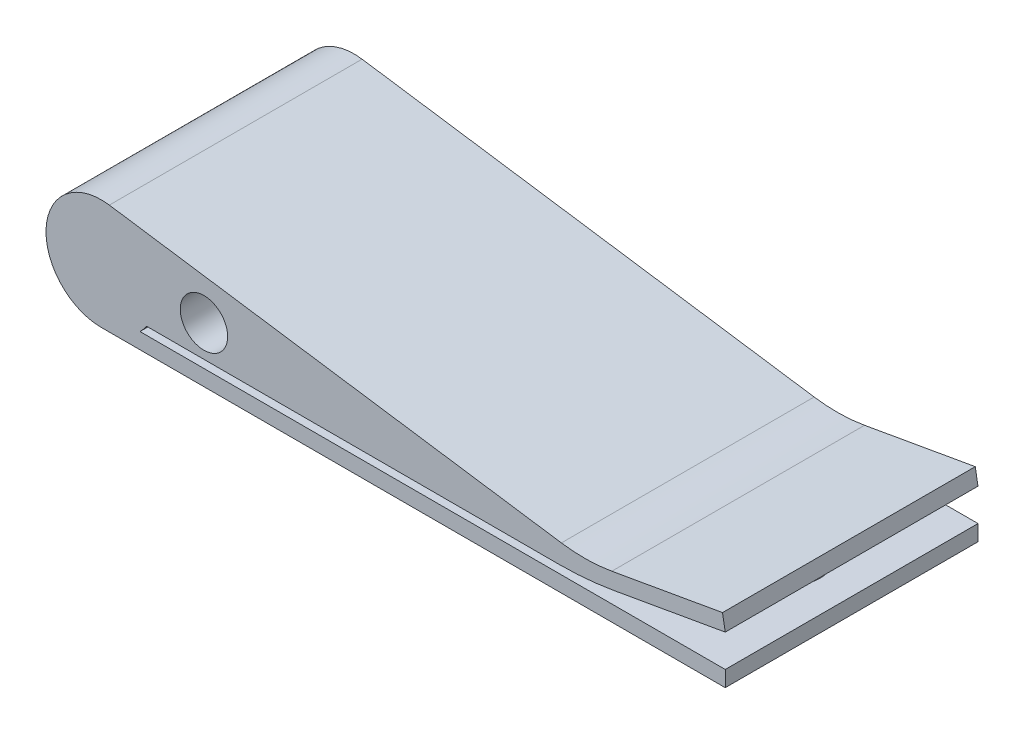
ISO-10303-21;
HEADER;
FILE_DESCRIPTION(('STEP AP214'),'2;1');
FILE_NAME('part.step','',(''),(''),'','','');
FILE_SCHEMA(('AUTOMOTIVE_DESIGN { 1 0 10303 214 1 1 1 1 }'));
ENDSEC;
DATA;
#1=APPLICATION_CONTEXT('core data for automotive mechanical design processes');
#2=APPLICATION_PROTOCOL_DEFINITION('international standard','automotive_design',2000,#1);
#3=PRODUCT_CONTEXT('',#1,'mechanical');
#4=PRODUCT('Part','Part','',(#3));
#5=PRODUCT_RELATED_PRODUCT_CATEGORY('part','',(#4));
#6=PRODUCT_DEFINITION_FORMATION('','',#4);
#7=PRODUCT_DEFINITION_CONTEXT('part definition',#1,'design');
#8=PRODUCT_DEFINITION('design','',#6,#7);
#9=PRODUCT_DEFINITION_SHAPE('','',#8);
#10=(LENGTH_UNIT() NAMED_UNIT(*) SI_UNIT(.MILLI.,.METRE.));
#11=(NAMED_UNIT(*) PLANE_ANGLE_UNIT() SI_UNIT($,.RADIAN.));
#12=(NAMED_UNIT(*) SI_UNIT($,.STERADIAN.) SOLID_ANGLE_UNIT());
#13=UNCERTAINTY_MEASURE_WITH_UNIT(LENGTH_MEASURE(1.E-05),#10,'distance_accuracy_value','');
#14=(GEOMETRIC_REPRESENTATION_CONTEXT(3) GLOBAL_UNCERTAINTY_ASSIGNED_CONTEXT((#13)) GLOBAL_UNIT_ASSIGNED_CONTEXT((#10,
#11,#12)) REPRESENTATION_CONTEXT('',''));
#15=CARTESIAN_POINT('',(0.,0.,0.));
#16=DIRECTION('',(0.,0.,1.));
#17=DIRECTION('',(1.,0.,0.));
#18=AXIS2_PLACEMENT_3D('',#15,#16,#17);
#19=CARTESIAN_POINT('',(43.,0.,16.));
#20=DIRECTION('',(-1.,0.,0.));
#21=DIRECTION('',(0.,0.,1.));
#22=AXIS2_PLACEMENT_3D('',#19,#20,#21);
#23=PLANE('',#22);
#24=DIRECTION('',(0.,1.,0.));
#25=VECTOR('',#24,1.);
#26=CARTESIAN_POINT('',(43.,0.,0.));
#27=LINE('',#26,#25);
#28=CARTESIAN_POINT('',(43.,0.,0.));
#29=VERTEX_POINT('',#28);
#30=CARTESIAN_POINT('',(43.,1.00000000000006,0.));
#31=VERTEX_POINT('',#30);
#32=EDGE_CURVE('E149',#29,#31,#27,.T.);
#33=ORIENTED_EDGE('',*,*,#32,.T.);
#34=DIRECTION('',(0.,0.,-1.));
#35=VECTOR('',#34,1.);
#36=CARTESIAN_POINT('',(43.,1.00000000000006,16.));
#37=LINE('',#36,#35);
#38=CARTESIAN_POINT('',(43.,1.00000000000006,16.));
#39=VERTEX_POINT('',#38);
#40=EDGE_CURVE('E130',#39,#31,#37,.T.);
#41=ORIENTED_EDGE('',*,*,#40,.F.);
#42=DIRECTION('',(0.,1.,0.));
#43=VECTOR('',#42,1.);
#44=CARTESIAN_POINT('',(43.,0.,16.));
#45=LINE('',#44,#43);
#46=CARTESIAN_POINT('',(43.,0.,16.));
#47=VERTEX_POINT('',#46);
#48=EDGE_CURVE('E137',#47,#39,#45,.T.);
#49=ORIENTED_EDGE('',*,*,#48,.F.);
#50=DIRECTION('',(0.,0.,-1.));
#51=VECTOR('',#50,1.);
#52=CARTESIAN_POINT('',(43.,0.,16.));
#53=LINE('',#52,#51);
#54=EDGE_CURVE('E196',#47,#29,#53,.T.);
#55=ORIENTED_EDGE('',*,*,#54,.T.);
#56=EDGE_LOOP('',(#33,#41,#49,#55));
#57=FACE_BOUND('',#56,.T.);
#58=ADVANCED_FACE('F37',(#57),#23,.F.);
#59=CARTESIAN_POINT('',(43.,1.00000000000006,16.));
#60=DIRECTION('',(0.,-1.,0.));
#61=DIRECTION('',(1.,0.,0.));
#62=AXIS2_PLACEMENT_3D('',#59,#60,#61);
#63=PLANE('',#62);
#64=CARTESIAN_POINT('',(39.,1.00000000000005,8.));
#65=DIRECTION('',(0.,-1.,0.));
#66=DIRECTION('',(1.,0.,0.));
#67=AXIS2_PLACEMENT_3D('',#64,#65,#66);
#68=CIRCLE('',#67,2.);
#69=CARTESIAN_POINT('',(41.,1.00000000000006,8.));
#70=VERTEX_POINT('',#69);
#71=EDGE_CURVE('E235',#70,#70,#68,.T.);
#72=ORIENTED_EDGE('',*,*,#71,.T.);
#73=EDGE_LOOP('',(#72));
#74=FACE_BOUND('',#73,.T.);
#75=CARTESIAN_POINT('',(16.,1.00000000000002,8.));
#76=DIRECTION('',(0.,-1.,0.));
#77=DIRECTION('',(1.,0.,0.));
#78=AXIS2_PLACEMENT_3D('',#75,#76,#77);
#79=CIRCLE('',#78,2.);
#80=CARTESIAN_POINT('',(18.,1.00000000000003,8.));
#81=VERTEX_POINT('',#80);
#82=EDGE_CURVE('E238',#81,#81,#79,.T.);
#83=ORIENTED_EDGE('',*,*,#82,.T.);
#84=EDGE_LOOP('',(#83));
#85=FACE_BOUND('',#84,.T.);
#86=DIRECTION('',(-1.,0.,0.));
#87=VECTOR('',#86,1.);
#88=CARTESIAN_POINT('',(43.,1.00000000000006,0.));
#89=LINE('',#88,#87);
#90=CARTESIAN_POINT('',(5.94948974278317,0.999999999999989,0.));
#91=VERTEX_POINT('',#90);
#92=EDGE_CURVE('E214',#31,#91,#89,.T.);
#93=ORIENTED_EDGE('',*,*,#92,.T.);
#94=DIRECTION('',(0.,0.,-1.));
#95=VECTOR('',#94,1.);
#96=CARTESIAN_POINT('',(5.94948974278317,0.999999999999989,16.));
#97=LINE('',#96,#95);
#98=CARTESIAN_POINT('',(5.94948974278317,0.999999999999989,16.));
#99=VERTEX_POINT('',#98);
#100=EDGE_CURVE('E133',#99,#91,#97,.T.);
#101=ORIENTED_EDGE('',*,*,#100,.F.);
#102=DIRECTION('',(-1.,0.,0.));
#103=VECTOR('',#102,1.);
#104=CARTESIAN_POINT('',(43.,1.00000000000006,16.));
#105=LINE('',#104,#103);
#106=EDGE_CURVE('E126',#39,#99,#105,.T.);
#107=ORIENTED_EDGE('',*,*,#106,.F.);
#108=ORIENTED_EDGE('',*,*,#40,.T.);
#109=EDGE_LOOP('',(#93,#101,#107,#108));
#110=FACE_BOUND('',#109,.T.);
#111=ADVANCED_FACE('F128',(#74,#85,#110),#63,.F.);
#112=CARTESIAN_POINT('',(3.5,3.5,16.));
#113=DIRECTION('',(0.,0.,-1.));
#114=DIRECTION('',(-1.,0.,0.));
#115=AXIS2_PLACEMENT_3D('',#112,#113,#114);
#116=CYLINDRICAL_SURFACE('',#115,3.5);
#117=CARTESIAN_POINT('',(3.5,3.5,0.));
#118=DIRECTION('',(0.,0.,1.));
#119=DIRECTION('',(1.,0.,0.));
#120=AXIS2_PLACEMENT_3D('',#117,#118,#119);
#121=CIRCLE('',#120,3.5);
#122=CARTESIAN_POINT('',(6.37228132326901,1.49999999999999,0.));
#123=VERTEX_POINT('',#122);
#124=EDGE_CURVE('E185',#91,#123,#121,.T.);
#125=ORIENTED_EDGE('',*,*,#124,.T.);
#126=DIRECTION('',(0.,0.,-1.));
#127=VECTOR('',#126,1.);
#128=CARTESIAN_POINT('',(6.37228132326901,1.49999999999999,16.));
#129=LINE('',#128,#127);
#130=CARTESIAN_POINT('',(6.37228132326901,1.49999999999999,16.));
#131=VERTEX_POINT('',#130);
#132=EDGE_CURVE('E155',#131,#123,#129,.T.);
#133=ORIENTED_EDGE('',*,*,#132,.F.);
#134=CARTESIAN_POINT('',(3.5,3.5,16.));
#135=DIRECTION('',(0.,0.,1.));
#136=DIRECTION('',(1.,0.,0.));
#137=AXIS2_PLACEMENT_3D('',#134,#135,#136);
#138=CIRCLE('',#137,3.5);
#139=EDGE_CURVE('E136',#99,#131,#138,.T.);
#140=ORIENTED_EDGE('',*,*,#139,.F.);
#141=ORIENTED_EDGE('',*,*,#100,.T.);
#142=EDGE_LOOP('',(#125,#133,#140,#141));
#143=FACE_BOUND('',#142,.T.);
#144=ADVANCED_FACE('F302',(#143),#116,.T.);
#145=CARTESIAN_POINT('',(6.37228132326901,1.49999999999999,16.));
#146=DIRECTION('',(0.,1.,0.));
#147=DIRECTION('',(-1.,0.,0.));
#148=AXIS2_PLACEMENT_3D('',#145,#146,#147);
#149=PLANE('',#148);
#150=DIRECTION('',(1.,0.,0.));
#151=VECTOR('',#150,1.);
#152=CARTESIAN_POINT('',(6.37228132326901,1.49999999999999,0.));
#153=LINE('',#152,#151);
#154=CARTESIAN_POINT('',(32.4765785518145,1.5,0.));
#155=VERTEX_POINT('',#154);
#156=EDGE_CURVE('E181',#123,#155,#153,.T.);
#157=ORIENTED_EDGE('',*,*,#156,.T.);
#158=DIRECTION('',(0.,0.,-1.));
#159=VECTOR('',#158,1.);
#160=CARTESIAN_POINT('',(32.4765785518146,1.5,16.));
#161=LINE('',#160,#159);
#162=CARTESIAN_POINT('',(32.4765785518145,1.5,16.));
#163=VERTEX_POINT('',#162);
#164=EDGE_CURVE('E45',#155,#163,#161,.F.);
#165=ORIENTED_EDGE('',*,*,#164,.T.);
#166=DIRECTION('',(1.,0.,0.));
#167=VECTOR('',#166,1.);
#168=CARTESIAN_POINT('',(6.37228132326901,1.49999999999999,16.));
#169=LINE('',#168,#167);
#170=EDGE_CURVE('E211',#131,#163,#169,.T.);
#171=ORIENTED_EDGE('',*,*,#170,.F.);
#172=ORIENTED_EDGE('',*,*,#132,.T.);
#173=EDGE_LOOP('',(#157,#165,#171,#172));
#174=FACE_BOUND('',#173,.T.);
#175=ADVANCED_FACE('F210',(#174),#149,.F.);
#176=CARTESIAN_POINT('',(34.226351822333,1.5,16.));
#177=DIRECTION('',(-0.173648177666927,0.984807753012209,0.));
#178=DIRECTION('',(-0.984807753012209,-0.173648177666927,0.));
#179=AXIS2_PLACEMENT_3D('',#176,#177,#178);
#180=PLANE('',#179);
#181=DIRECTION('',(0.984807753012209,0.173648177666927,0.));
#182=VECTOR('',#181,1.);
#183=CARTESIAN_POINT('',(34.226351822333,1.5,16.));
#184=LINE('',#183,#182);
#185=CARTESIAN_POINT('',(35.9495421051531,1.80384493975583,16.));
#186=VERTEX_POINT('',#185);
#187=CARTESIAN_POINT('',(43.,3.04703089296632,16.));
#188=VERTEX_POINT('',#187);
#189=EDGE_CURVE('E174',#186,#188,#184,.T.);
#190=ORIENTED_EDGE('',*,*,#189,.F.);
#191=DIRECTION('',(0.,0.,-1.));
#192=VECTOR('',#191,1.);
#193=CARTESIAN_POINT('',(35.9495421051531,1.80384493975583,16.));
#194=LINE('',#193,#192);
#195=CARTESIAN_POINT('',(35.9495421051531,1.80384493975583,0.));
#196=VERTEX_POINT('',#195);
#197=EDGE_CURVE('E164',#186,#196,#194,.T.);
#198=ORIENTED_EDGE('',*,*,#197,.T.);
#199=DIRECTION('',(0.984807753012209,0.173648177666927,0.));
#200=VECTOR('',#199,1.);
#201=CARTESIAN_POINT('',(34.226351822333,1.5,0.));
#202=LINE('',#201,#200);
#203=CARTESIAN_POINT('',(43.,3.04703089296632,0.));
#204=VERTEX_POINT('',#203);
#205=EDGE_CURVE('E172',#196,#204,#202,.T.);
#206=ORIENTED_EDGE('',*,*,#205,.T.);
#207=DIRECTION('',(0.,0.,-1.));
#208=VECTOR('',#207,1.);
#209=CARTESIAN_POINT('',(43.,3.04703089296632,16.));
#210=LINE('',#209,#208);
#211=EDGE_CURVE('E207',#188,#204,#210,.T.);
#212=ORIENTED_EDGE('',*,*,#211,.F.);
#213=EDGE_LOOP('',(#190,#198,#206,#212));
#214=FACE_BOUND('',#213,.T.);
#215=ADVANCED_FACE('F170',(#214),#180,.F.);
#216=CARTESIAN_POINT('',(43.,3.04703089296632,16.));
#217=DIRECTION('',(-0.984807753012208,-0.173648177666928,0.));
#218=DIRECTION('',(0.173648177666928,-0.984807753012208,0.));
#219=AXIS2_PLACEMENT_3D('',#216,#217,#218);
#220=PLANE('',#219);
#221=DIRECTION('',(-0.173648177666928,0.984807753012208,0.));
#222=VECTOR('',#221,1.);
#223=CARTESIAN_POINT('',(43.,3.04703089296632,0.));
#224=LINE('',#223,#222);
#225=CARTESIAN_POINT('',(42.8263518223331,4.03183864597852,0.));
#226=VERTEX_POINT('',#225);
#227=EDGE_CURVE('E180',#204,#226,#224,.T.);
#228=ORIENTED_EDGE('',*,*,#227,.T.);
#229=DIRECTION('',(0.,0.,-1.));
#230=VECTOR('',#229,1.);
#231=CARTESIAN_POINT('',(42.8263518223331,4.03183864597852,16.));
#232=LINE('',#231,#230);
#233=CARTESIAN_POINT('',(42.8263518223331,4.03183864597852,16.));
#234=VERTEX_POINT('',#233);
#235=EDGE_CURVE('E204',#234,#226,#232,.T.);
#236=ORIENTED_EDGE('',*,*,#235,.F.);
#237=DIRECTION('',(-0.173648177666928,0.984807753012208,0.));
#238=VECTOR('',#237,1.);
#239=CARTESIAN_POINT('',(43.,3.04703089296632,16.));
#240=LINE('',#239,#238);
#241=EDGE_CURVE('E227',#188,#234,#240,.T.);
#242=ORIENTED_EDGE('',*,*,#241,.F.);
#243=ORIENTED_EDGE('',*,*,#211,.T.);
#244=EDGE_LOOP('',(#228,#236,#242,#243));
#245=FACE_BOUND('',#244,.T.);
#246=ADVANCED_FACE('F287',(#245),#220,.F.);
#247=CARTESIAN_POINT('',(42.8263518223331,4.03183864597852,16.));
#248=DIRECTION('',(0.173648177666927,-0.984807753012209,0.));
#249=DIRECTION('',(0.984807753012209,0.173648177666927,0.));
#250=AXIS2_PLACEMENT_3D('',#247,#248,#249);
#251=PLANE('',#250);
#252=DIRECTION('',(-0.984807753012209,-0.173648177666927,0.));
#253=VECTOR('',#252,1.);
#254=CARTESIAN_POINT('',(42.8263518223331,4.03183864597852,0.));
#255=LINE('',#254,#253);
#256=CARTESIAN_POINT('',(35.8189788898338,2.79624973409273,0.));
#257=VERTEX_POINT('',#256);
#258=EDGE_CURVE('E183',#226,#257,#255,.T.);
#259=ORIENTED_EDGE('',*,*,#258,.T.);
#260=DIRECTION('',(0.,0.,-1.));
#261=VECTOR('',#260,1.);
#262=CARTESIAN_POINT('',(35.8189788898338,2.79624973409273,16.));
#263=LINE('',#262,#261);
#264=CARTESIAN_POINT('',(35.8189788898338,2.79624973409273,16.));
#265=VERTEX_POINT('',#264);
#266=EDGE_CURVE('E153',#257,#265,#263,.F.);
#267=ORIENTED_EDGE('',*,*,#266,.T.);
#268=DIRECTION('',(-0.984807753012209,-0.173648177666927,0.));
#269=VECTOR('',#268,1.);
#270=CARTESIAN_POINT('',(42.8263518223331,4.03183864597852,16.));
#271=LINE('',#270,#269);
#272=EDGE_CURVE('E224',#234,#265,#271,.T.);
#273=ORIENTED_EDGE('',*,*,#272,.F.);
#274=ORIENTED_EDGE('',*,*,#235,.T.);
#275=EDGE_LOOP('',(#259,#267,#273,#274));
#276=FACE_BOUND('',#275,.T.);
#277=ADVANCED_FACE('F282',(#276),#251,.F.);
#278=CARTESIAN_POINT('',(34.226351822333,2.51542661188574,16.));
#279=DIRECTION('',(-0.145610511259874,-0.98934199294816,0.));
#280=DIRECTION('',(0.98934199294816,-0.145610511259874,0.));
#281=AXIS2_PLACEMENT_3D('',#278,#279,#280);
#282=PLANE('',#281);
#283=DIRECTION('',(-0.98934199294816,0.145610511259874,0.));
#284=VECTOR('',#283,1.);
#285=CARTESIAN_POINT('',(34.226351822333,2.51542661188574,16.));
#286=LINE('',#285,#284);
#287=CARTESIAN_POINT('',(32.6263920005658,2.75090733473321,16.));
#288=VERTEX_POINT('',#287);
#289=CARTESIAN_POINT('',(4.00963678940955,6.96269697531856,16.));
#290=VERTEX_POINT('',#289);
#291=EDGE_CURVE('E222',#288,#290,#286,.T.);
#292=ORIENTED_EDGE('',*,*,#291,.F.);
#293=DIRECTION('',(0.,0.,-1.));
#294=VECTOR('',#293,1.);
#295=CARTESIAN_POINT('',(32.6263920005658,2.75090733473321,0.));
#296=LINE('',#295,#294);
#297=CARTESIAN_POINT('',(32.6263920005658,2.75090733473321,0.));
#298=VERTEX_POINT('',#297);
#299=EDGE_CURVE('E150',#288,#298,#296,.T.);
#300=ORIENTED_EDGE('',*,*,#299,.T.);
#301=DIRECTION('',(-0.98934199294816,0.145610511259874,0.));
#302=VECTOR('',#301,1.);
#303=CARTESIAN_POINT('',(34.226351822333,2.51542661188574,0.));
#304=LINE('',#303,#302);
#305=CARTESIAN_POINT('',(4.00963678940955,6.96269697531856,0.));
#306=VERTEX_POINT('',#305);
#307=EDGE_CURVE('E191',#298,#306,#304,.T.);
#308=ORIENTED_EDGE('',*,*,#307,.T.);
#309=DIRECTION('',(0.,0.,-1.));
#310=VECTOR('',#309,1.);
#311=CARTESIAN_POINT('',(4.00963678940955,6.96269697531856,16.));
#312=LINE('',#311,#310);
#313=EDGE_CURVE('E201',#290,#306,#312,.T.);
#314=ORIENTED_EDGE('',*,*,#313,.F.);
#315=EDGE_LOOP('',(#292,#300,#308,#314));
#316=FACE_BOUND('',#315,.T.);
#317=ADVANCED_FACE('F275',(#316),#282,.F.);
#318=CARTESIAN_POINT('',(3.5,3.5,16.));
#319=DIRECTION('',(0.,0.,-1.));
#320=DIRECTION('',(-1.,0.,0.));
#321=AXIS2_PLACEMENT_3D('',#318,#319,#320);
#322=CYLINDRICAL_SURFACE('',#321,3.5);
#323=CARTESIAN_POINT('',(3.5,3.5,0.));
#324=DIRECTION('',(0.,0.,1.));
#325=DIRECTION('',(1.,0.,0.));
#326=AXIS2_PLACEMENT_3D('',#323,#324,#325);
#327=CIRCLE('',#326,3.5);
#328=CARTESIAN_POINT('',(3.5,0.,0.));
#329=VERTEX_POINT('',#328);
#330=EDGE_CURVE('E193',#306,#329,#327,.T.);
#331=ORIENTED_EDGE('',*,*,#330,.T.);
#332=DIRECTION('',(0.,0.,-1.));
#333=VECTOR('',#332,1.);
#334=CARTESIAN_POINT('',(3.5,0.,16.));
#335=LINE('',#334,#333);
#336=CARTESIAN_POINT('',(3.5,0.,16.));
#337=VERTEX_POINT('',#336);
#338=EDGE_CURVE('E198',#337,#329,#335,.T.);
#339=ORIENTED_EDGE('',*,*,#338,.F.);
#340=CARTESIAN_POINT('',(3.5,3.5,16.));
#341=DIRECTION('',(0.,0.,1.));
#342=DIRECTION('',(1.,0.,0.));
#343=AXIS2_PLACEMENT_3D('',#340,#341,#342);
#344=CIRCLE('',#343,3.5);
#345=EDGE_CURVE('E220',#290,#337,#344,.T.);
#346=ORIENTED_EDGE('',*,*,#345,.F.);
#347=ORIENTED_EDGE('',*,*,#313,.T.);
#348=EDGE_LOOP('',(#331,#339,#346,#347));
#349=FACE_BOUND('',#348,.T.);
#350=ADVANCED_FACE('F262',(#349),#322,.T.);
#351=CARTESIAN_POINT('',(3.5,0.,16.));
#352=DIRECTION('',(0.,1.,0.));
#353=DIRECTION('',(-1.,0.,0.));
#354=AXIS2_PLACEMENT_3D('',#351,#352,#353);
#355=PLANE('',#354);
#356=CARTESIAN_POINT('',(39.,0.,8.));
#357=DIRECTION('',(0.,-1.,0.));
#358=DIRECTION('',(1.,0.,0.));
#359=AXIS2_PLACEMENT_3D('',#356,#357,#358);
#360=CIRCLE('',#359,2.);
#361=CARTESIAN_POINT('',(41.,0.,8.));
#362=VERTEX_POINT('',#361);
#363=EDGE_CURVE('E244',#362,#362,#360,.T.);
#364=ORIENTED_EDGE('',*,*,#363,.F.);
#365=EDGE_LOOP('',(#364));
#366=FACE_BOUND('',#365,.T.);
#367=CARTESIAN_POINT('',(16.,0.,8.));
#368=DIRECTION('',(0.,-1.,0.));
#369=DIRECTION('',(1.,0.,0.));
#370=AXIS2_PLACEMENT_3D('',#367,#368,#369);
#371=CIRCLE('',#370,2.);
#372=CARTESIAN_POINT('',(18.,0.,8.));
#373=VERTEX_POINT('',#372);
#374=EDGE_CURVE('E241',#373,#373,#371,.T.);
#375=ORIENTED_EDGE('',*,*,#374,.F.);
#376=EDGE_LOOP('',(#375));
#377=FACE_BOUND('',#376,.T.);
#378=DIRECTION('',(1.,0.,0.));
#379=VECTOR('',#378,1.);
#380=CARTESIAN_POINT('',(3.5,0.,0.));
#381=LINE('',#380,#379);
#382=EDGE_CURVE('E146',#329,#29,#381,.T.);
#383=ORIENTED_EDGE('',*,*,#382,.T.);
#384=ORIENTED_EDGE('',*,*,#54,.F.);
#385=DIRECTION('',(1.,0.,0.));
#386=VECTOR('',#385,1.);
#387=CARTESIAN_POINT('',(3.5,0.,16.));
#388=LINE('',#387,#386);
#389=EDGE_CURVE('E142',#337,#47,#388,.T.);
#390=ORIENTED_EDGE('',*,*,#389,.F.);
#391=ORIENTED_EDGE('',*,*,#338,.T.);
#392=EDGE_LOOP('',(#383,#384,#390,#391));
#393=FACE_BOUND('',#392,.T.);
#394=ADVANCED_FACE('F259',(#366,#377,#393),#355,.F.);
#395=CARTESIAN_POINT('',(3.5,3.5,16.));
#396=DIRECTION('',(0.,0.,1.));
#397=DIRECTION('',(1.,0.,0.));
#398=AXIS2_PLACEMENT_3D('',#395,#396,#397);
#399=PLANE('',#398);
#400=CARTESIAN_POINT('',(10.,3.5,16.));
#401=DIRECTION('',(0.,0.,1.));
#402=DIRECTION('',(1.,0.,0.));
#403=AXIS2_PLACEMENT_3D('',#400,#401,#402);
#404=CIRCLE('',#403,1.5);
#405=CARTESIAN_POINT('',(11.5,3.5,16.));
#406=VERTEX_POINT('',#405);
#407=EDGE_CURVE('E232',#406,#406,#404,.T.);
#408=ORIENTED_EDGE('',*,*,#407,.F.);
#409=EDGE_LOOP('',(#408));
#410=FACE_BOUND('',#409,.T.);
#411=ORIENTED_EDGE('',*,*,#170,.T.);
#412=CARTESIAN_POINT('',(32.4765785518146,21.5,16.));
#413=DIRECTION('',(0.,0.,1.));
#414=DIRECTION('',(1.,0.,0.));
#415=AXIS2_PLACEMENT_3D('',#412,#413,#414);
#416=CIRCLE('',#415,20.);
#417=EDGE_CURVE('E11',#163,#186,#416,.T.);
#418=ORIENTED_EDGE('',*,*,#417,.T.);
#419=ORIENTED_EDGE('',*,*,#189,.T.);
#420=ORIENTED_EDGE('',*,*,#241,.T.);
#421=ORIENTED_EDGE('',*,*,#272,.T.);
#422=CARTESIAN_POINT('',(34.0824971131645,12.6443272642148,16.));
#423=DIRECTION('',(0.,0.,1.));
#424=DIRECTION('',(1.,0.,0.));
#425=AXIS2_PLACEMENT_3D('',#422,#423,#424);
#426=CIRCLE('',#425,10.);
#427=EDGE_CURVE('E162',#265,#288,#426,.F.);
#428=ORIENTED_EDGE('',*,*,#427,.T.);
#429=ORIENTED_EDGE('',*,*,#291,.T.);
#430=ORIENTED_EDGE('',*,*,#345,.T.);
#431=ORIENTED_EDGE('',*,*,#389,.T.);
#432=ORIENTED_EDGE('',*,*,#48,.T.);
#433=ORIENTED_EDGE('',*,*,#106,.T.);
#434=ORIENTED_EDGE('',*,*,#139,.T.);
#435=EDGE_LOOP('',(#411,#418,#419,#420,#421,#428,#429,#430,#431,#432,#433,#434));
#436=FACE_BOUND('',#435,.T.);
#437=ADVANCED_FACE('F140',(#410,#436),#399,.T.);
#438=CARTESIAN_POINT('',(3.5,3.5,0.));
#439=DIRECTION('',(0.,0.,1.));
#440=DIRECTION('',(1.,0.,0.));
#441=AXIS2_PLACEMENT_3D('',#438,#439,#440);
#442=PLANE('',#441);
#443=CARTESIAN_POINT('',(10.,3.5,0.));
#444=DIRECTION('',(0.,0.,1.));
#445=DIRECTION('',(1.,0.,0.));
#446=AXIS2_PLACEMENT_3D('',#443,#444,#445);
#447=CIRCLE('',#446,1.5);
#448=CARTESIAN_POINT('',(11.5,3.5,0.));
#449=VERTEX_POINT('',#448);
#450=EDGE_CURVE('E218',#449,#449,#447,.T.);
#451=ORIENTED_EDGE('',*,*,#450,.T.);
#452=EDGE_LOOP('',(#451));
#453=FACE_BOUND('',#452,.T.);
#454=ORIENTED_EDGE('',*,*,#205,.F.);
#455=CARTESIAN_POINT('',(32.4765785518146,21.5,0.));
#456=DIRECTION('',(0.,0.,1.));
#457=DIRECTION('',(1.,0.,0.));
#458=AXIS2_PLACEMENT_3D('',#455,#456,#457);
#459=CIRCLE('',#458,20.);
#460=EDGE_CURVE('E59',#196,#155,#459,.F.);
#461=ORIENTED_EDGE('',*,*,#460,.T.);
#462=ORIENTED_EDGE('',*,*,#156,.F.);
#463=ORIENTED_EDGE('',*,*,#124,.F.);
#464=ORIENTED_EDGE('',*,*,#92,.F.);
#465=ORIENTED_EDGE('',*,*,#32,.F.);
#466=ORIENTED_EDGE('',*,*,#382,.F.);
#467=ORIENTED_EDGE('',*,*,#330,.F.);
#468=ORIENTED_EDGE('',*,*,#307,.F.);
#469=CARTESIAN_POINT('',(34.0824971131645,12.6443272642148,0.));
#470=DIRECTION('',(0.,0.,1.));
#471=DIRECTION('',(1.,0.,0.));
#472=AXIS2_PLACEMENT_3D('',#469,#470,#471);
#473=CIRCLE('',#472,10.);
#474=EDGE_CURVE('E160',#298,#257,#473,.T.);
#475=ORIENTED_EDGE('',*,*,#474,.T.);
#476=ORIENTED_EDGE('',*,*,#258,.F.);
#477=ORIENTED_EDGE('',*,*,#227,.F.);
#478=EDGE_LOOP('',(#454,#461,#462,#463,#464,#465,#466,#467,#468,#475,#476,#477));
#479=FACE_BOUND('',#478,.T.);
#480=ADVANCED_FACE('F178',(#453,#479),#442,.F.);
#481=CARTESIAN_POINT('',(34.0824971131645,12.6443272642148,16.));
#482=DIRECTION('',(0.,0.,1.));
#483=DIRECTION('',(1.,0.,0.));
#484=AXIS2_PLACEMENT_3D('',#481,#482,#483);
#485=CYLINDRICAL_SURFACE('',#484,10.);
#486=ORIENTED_EDGE('',*,*,#427,.F.);
#487=ORIENTED_EDGE('',*,*,#266,.F.);
#488=ORIENTED_EDGE('',*,*,#474,.F.);
#489=ORIENTED_EDGE('',*,*,#299,.F.);
#490=EDGE_LOOP('',(#486,#487,#488,#489));
#491=FACE_BOUND('',#490,.T.);
#492=ADVANCED_FACE('F279',(#491),#485,.F.);
#493=CARTESIAN_POINT('',(32.4765785518146,21.5,16.));
#494=DIRECTION('',(0.,0.,-1.));
#495=DIRECTION('',(-1.,0.,0.));
#496=AXIS2_PLACEMENT_3D('',#493,#494,#495);
#497=CYLINDRICAL_SURFACE('',#496,20.);
#498=ORIENTED_EDGE('',*,*,#417,.F.);
#499=ORIENTED_EDGE('',*,*,#164,.F.);
#500=ORIENTED_EDGE('',*,*,#460,.F.);
#501=ORIENTED_EDGE('',*,*,#197,.F.);
#502=EDGE_LOOP('',(#498,#499,#500,#501));
#503=FACE_BOUND('',#502,.T.);
#504=ADVANCED_FACE('F39',(#503),#497,.T.);
#505=CARTESIAN_POINT('',(10.,3.5,0.));
#506=DIRECTION('',(0.,0.,1.));
#507=DIRECTION('',(1.,0.,0.));
#508=AXIS2_PLACEMENT_3D('',#505,#506,#507);
#509=CYLINDRICAL_SURFACE('',#508,1.5);
#510=ORIENTED_EDGE('',*,*,#450,.F.);
#511=EDGE_LOOP('',(#510));
#512=FACE_BOUND('',#511,.T.);
#513=ORIENTED_EDGE('',*,*,#407,.T.);
#514=EDGE_LOOP('',(#513));
#515=FACE_BOUND('',#514,.T.);
#516=ADVANCED_FACE('F289',(#512,#515),#509,.F.);
#517=CARTESIAN_POINT('',(16.,1.00000000000002,8.));
#518=DIRECTION('',(0.,-1.,0.));
#519=DIRECTION('',(1.,0.,0.));
#520=AXIS2_PLACEMENT_3D('',#517,#518,#519);
#521=CYLINDRICAL_SURFACE('',#520,2.);
#522=ORIENTED_EDGE('',*,*,#82,.F.);
#523=EDGE_LOOP('',(#522));
#524=FACE_BOUND('',#523,.T.);
#525=ORIENTED_EDGE('',*,*,#374,.T.);
#526=EDGE_LOOP('',(#525));
#527=FACE_BOUND('',#526,.T.);
#528=ADVANCED_FACE('F255',(#524,#527),#521,.F.);
#529=CARTESIAN_POINT('',(39.,1.00000000000005,8.));
#530=DIRECTION('',(0.,-1.,0.));
#531=DIRECTION('',(1.,0.,0.));
#532=AXIS2_PLACEMENT_3D('',#529,#530,#531);
#533=CYLINDRICAL_SURFACE('',#532,2.);
#534=ORIENTED_EDGE('',*,*,#71,.F.);
#535=EDGE_LOOP('',(#534));
#536=FACE_BOUND('',#535,.T.);
#537=ORIENTED_EDGE('',*,*,#363,.T.);
#538=EDGE_LOOP('',(#537));
#539=FACE_BOUND('',#538,.T.);
#540=ADVANCED_FACE('F252',(#536,#539),#533,.F.);
#541=CLOSED_SHELL('',(#58,#111,#144,#175,#215,#246,#277,#317,#350,#394,#437,#480,#492,#504,#516,
#528,#540));
#542=MANIFOLD_SOLID_BREP('B2',#541);
#543=ADVANCED_BREP_SHAPE_REPRESENTATION('',(#18,#542),#14);
#544=SHAPE_DEFINITION_REPRESENTATION(#9,#543);
ENDSEC;
END-ISO-10303-21;
